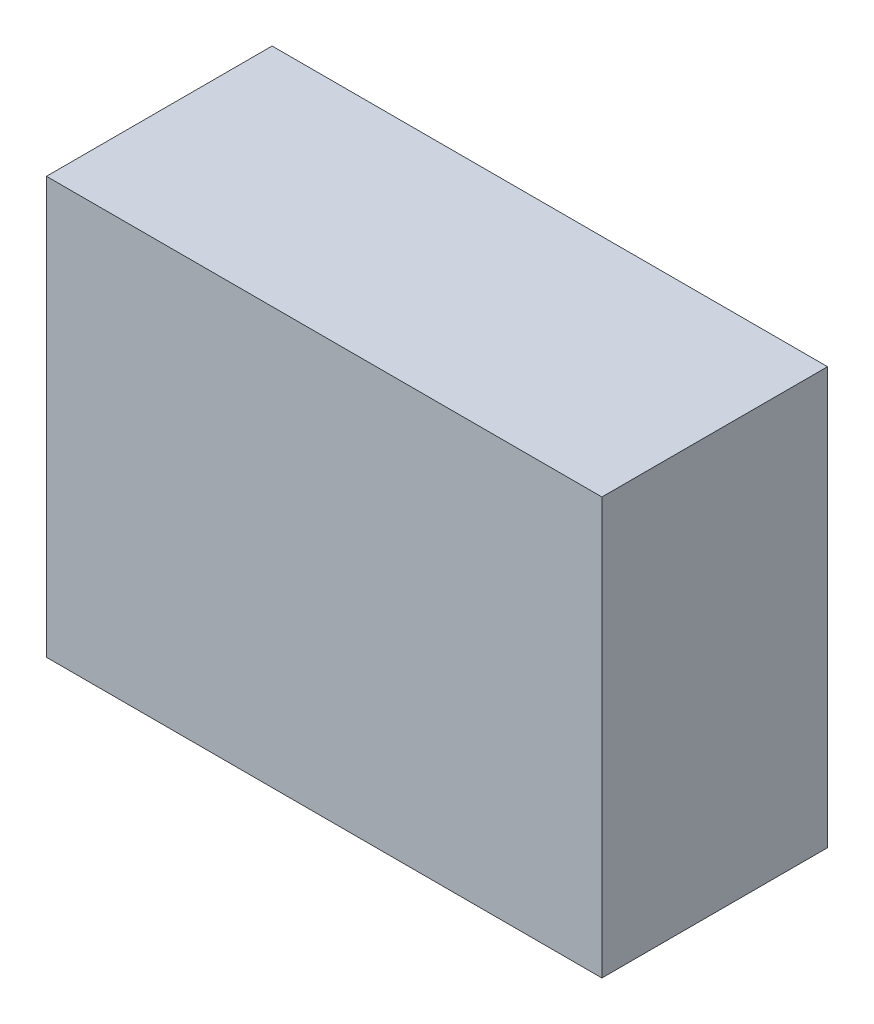
ISO-10303-21;
HEADER;
FILE_DESCRIPTION(('STEP AP214'),'2;1');
FILE_NAME('part.step','',(''),(''),'','','');
FILE_SCHEMA(('AUTOMOTIVE_DESIGN { 1 0 10303 214 1 1 1 1 }'));
ENDSEC;
DATA;
#1=APPLICATION_CONTEXT('core data for automotive mechanical design processes');
#2=APPLICATION_PROTOCOL_DEFINITION('international standard','automotive_design',2000,#1);
#3=PRODUCT_CONTEXT('',#1,'mechanical');
#4=PRODUCT('Part','Part','',(#3));
#5=PRODUCT_RELATED_PRODUCT_CATEGORY('part','',(#4));
#6=PRODUCT_DEFINITION_FORMATION('','',#4);
#7=PRODUCT_DEFINITION_CONTEXT('part definition',#1,'design');
#8=PRODUCT_DEFINITION('design','',#6,#7);
#9=PRODUCT_DEFINITION_SHAPE('','',#8);
#10=(LENGTH_UNIT() NAMED_UNIT(*) SI_UNIT(.MILLI.,.METRE.));
#11=(NAMED_UNIT(*) PLANE_ANGLE_UNIT() SI_UNIT($,.RADIAN.));
#12=(NAMED_UNIT(*) SI_UNIT($,.STERADIAN.) SOLID_ANGLE_UNIT());
#13=UNCERTAINTY_MEASURE_WITH_UNIT(LENGTH_MEASURE(1.E-05),#10,'distance_accuracy_value','');
#14=(GEOMETRIC_REPRESENTATION_CONTEXT(3) GLOBAL_UNCERTAINTY_ASSIGNED_CONTEXT((#13)) GLOBAL_UNIT_ASSIGNED_CONTEXT((#10,
#11,#12)) REPRESENTATION_CONTEXT('',''));
#15=CARTESIAN_POINT('',(0.,0.,0.));
#16=DIRECTION('',(0.,0.,1.));
#17=DIRECTION('',(1.,0.,0.));
#18=AXIS2_PLACEMENT_3D('',#15,#16,#17);
#19=CARTESIAN_POINT('',(-0.7999984,-0.5999988,0.65000124));
#20=DIRECTION('',(0.,0.,-1.));
#21=DIRECTION('',(-1.,0.,0.));
#22=AXIS2_PLACEMENT_3D('',#19,#20,#21);
#23=PLANE('',#22);
#24=DIRECTION('',(0.,1.,0.));
#25=VECTOR('',#24,1.);
#26=CARTESIAN_POINT('',(0.80000094,-0.5999988,0.65000124));
#27=LINE('',#26,#25);
#28=CARTESIAN_POINT('',(0.80000094,-0.5999988,0.65000124));
#29=VERTEX_POINT('',#28);
#30=CARTESIAN_POINT('',(0.80000094,0.5999988,0.65000124));
#31=VERTEX_POINT('',#30);
#32=EDGE_CURVE('E54',#29,#31,#27,.T.);
#33=ORIENTED_EDGE('',*,*,#32,.T.);
#34=DIRECTION('',(1.,0.,0.));
#35=VECTOR('',#34,1.);
#36=CARTESIAN_POINT('',(0.80000094,0.5999988,0.65000124));
#37=LINE('',#36,#35);
#38=CARTESIAN_POINT('',(-0.7999984,0.5999988,0.65000124));
#39=VERTEX_POINT('',#38);
#40=EDGE_CURVE('E56',#31,#39,#37,.F.);
#41=ORIENTED_EDGE('',*,*,#40,.T.);
#42=DIRECTION('',(0.,1.,0.));
#43=VECTOR('',#42,1.);
#44=CARTESIAN_POINT('',(-0.7999984,0.5999988,0.65000124));
#45=LINE('',#44,#43);
#46=CARTESIAN_POINT('',(-0.7999984,-0.5999988,0.65000124));
#47=VERTEX_POINT('',#46);
#48=EDGE_CURVE('E19',#39,#47,#45,.F.);
#49=ORIENTED_EDGE('',*,*,#48,.T.);
#50=DIRECTION('',(1.,0.,0.));
#51=VECTOR('',#50,1.);
#52=CARTESIAN_POINT('',(-0.7999984,-0.5999988,0.65000124));
#53=LINE('',#52,#51);
#54=EDGE_CURVE('E79',#47,#29,#53,.T.);
#55=ORIENTED_EDGE('',*,*,#54,.T.);
#56=EDGE_LOOP('',(#33,#41,#49,#55));
#57=FACE_BOUND('',#56,.T.);
#58=ADVANCED_FACE('F16',(#57),#23,.F.);
#59=CARTESIAN_POINT('',(-0.7999984,0.5999988,0.));
#60=DIRECTION('',(1.,0.,0.));
#61=DIRECTION('',(0.,0.,-1.));
#62=AXIS2_PLACEMENT_3D('',#59,#60,#61);
#63=PLANE('',#62);
#64=DIRECTION('',(0.,0.,1.));
#65=VECTOR('',#64,1.);
#66=CARTESIAN_POINT('',(-0.7999984,-0.5999988,0.));
#67=LINE('',#66,#65);
#68=CARTESIAN_POINT('',(-0.7999984,-0.5999988,0.));
#69=VERTEX_POINT('',#68);
#70=EDGE_CURVE('E67',#69,#47,#67,.T.);
#71=ORIENTED_EDGE('',*,*,#70,.T.);
#72=ORIENTED_EDGE('',*,*,#48,.F.);
#73=DIRECTION('',(0.,0.,-1.));
#74=VECTOR('',#73,1.);
#75=CARTESIAN_POINT('',(-0.7999984,0.5999988,0.));
#76=LINE('',#75,#74);
#77=CARTESIAN_POINT('',(-0.7999984,0.5999988,0.));
#78=VERTEX_POINT('',#77);
#79=EDGE_CURVE('E62',#39,#78,#76,.T.);
#80=ORIENTED_EDGE('',*,*,#79,.T.);
#81=DIRECTION('',(0.,1.,0.));
#82=VECTOR('',#81,1.);
#83=CARTESIAN_POINT('',(-0.7999984,-0.5999988,0.));
#84=LINE('',#83,#82);
#85=EDGE_CURVE('E82',#69,#78,#84,.T.);
#86=ORIENTED_EDGE('',*,*,#85,.F.);
#87=EDGE_LOOP('',(#71,#72,#80,#86));
#88=FACE_BOUND('',#87,.T.);
#89=ADVANCED_FACE('F64',(#88),#63,.F.);
#90=CARTESIAN_POINT('',(0.80000094,0.5999988,0.));
#91=DIRECTION('',(0.,-1.,0.));
#92=DIRECTION('',(0.,0.,-1.));
#93=AXIS2_PLACEMENT_3D('',#90,#91,#92);
#94=PLANE('',#93);
#95=ORIENTED_EDGE('',*,*,#79,.F.);
#96=ORIENTED_EDGE('',*,*,#40,.F.);
#97=DIRECTION('',(0.,0.,1.));
#98=VECTOR('',#97,1.);
#99=CARTESIAN_POINT('',(0.80000094,0.5999988,0.));
#100=LINE('',#99,#98);
#101=CARTESIAN_POINT('',(0.80000094,0.5999988,0.));
#102=VERTEX_POINT('',#101);
#103=EDGE_CURVE('E74',#31,#102,#100,.F.);
#104=ORIENTED_EDGE('',*,*,#103,.T.);
#105=DIRECTION('',(-1.,0.,0.));
#106=VECTOR('',#105,1.);
#107=CARTESIAN_POINT('',(-0.7999984,0.5999988,0.));
#108=LINE('',#107,#106);
#109=EDGE_CURVE('E71',#78,#102,#108,.F.);
#110=ORIENTED_EDGE('',*,*,#109,.F.);
#111=EDGE_LOOP('',(#95,#96,#104,#110));
#112=FACE_BOUND('',#111,.T.);
#113=ADVANCED_FACE('F69',(#112),#94,.F.);
#114=CARTESIAN_POINT('',(0.80000094,-0.5999988,0.));
#115=DIRECTION('',(-1.,0.,0.));
#116=DIRECTION('',(0.,0.,1.));
#117=AXIS2_PLACEMENT_3D('',#114,#115,#116);
#118=PLANE('',#117);
#119=ORIENTED_EDGE('',*,*,#103,.F.);
#120=ORIENTED_EDGE('',*,*,#32,.F.);
#121=DIRECTION('',(0.,0.,1.));
#122=VECTOR('',#121,1.);
#123=CARTESIAN_POINT('',(0.80000094,-0.5999988,0.));
#124=LINE('',#123,#122);
#125=CARTESIAN_POINT('',(0.80000094,-0.5999988,0.));
#126=VERTEX_POINT('',#125);
#127=EDGE_CURVE('E34',#29,#126,#124,.F.);
#128=ORIENTED_EDGE('',*,*,#127,.T.);
#129=DIRECTION('',(0.,1.,0.));
#130=VECTOR('',#129,1.);
#131=CARTESIAN_POINT('',(0.80000094,-0.5999988,0.));
#132=LINE('',#131,#130);
#133=EDGE_CURVE('E25',#102,#126,#132,.F.);
#134=ORIENTED_EDGE('',*,*,#133,.F.);
#135=EDGE_LOOP('',(#119,#120,#128,#134));
#136=FACE_BOUND('',#135,.T.);
#137=ADVANCED_FACE('F88',(#136),#118,.F.);
#138=CARTESIAN_POINT('',(-0.7999984,-0.5999988,0.));
#139=DIRECTION('',(0.,1.,0.));
#140=DIRECTION('',(0.,0.,1.));
#141=AXIS2_PLACEMENT_3D('',#138,#139,#140);
#142=PLANE('',#141);
#143=ORIENTED_EDGE('',*,*,#127,.F.);
#144=ORIENTED_EDGE('',*,*,#54,.F.);
#145=ORIENTED_EDGE('',*,*,#70,.F.);
#146=DIRECTION('',(-1.,0.,0.));
#147=VECTOR('',#146,1.);
#148=CARTESIAN_POINT('',(-0.7999984,-0.5999988,0.));
#149=LINE('',#148,#147);
#150=EDGE_CURVE('E11',#126,#69,#149,.T.);
#151=ORIENTED_EDGE('',*,*,#150,.F.);
#152=EDGE_LOOP('',(#143,#144,#145,#151));
#153=FACE_BOUND('',#152,.T.);
#154=ADVANCED_FACE('F90',(#153),#142,.F.);
#155=CARTESIAN_POINT('',(-0.7999984,-0.5999988,0.));
#156=DIRECTION('',(0.,0.,-1.));
#157=DIRECTION('',(-1.,0.,0.));
#158=AXIS2_PLACEMENT_3D('',#155,#156,#157);
#159=PLANE('',#158);
#160=ORIENTED_EDGE('',*,*,#133,.T.);
#161=ORIENTED_EDGE('',*,*,#150,.T.);
#162=ORIENTED_EDGE('',*,*,#85,.T.);
#163=ORIENTED_EDGE('',*,*,#109,.T.);
#164=EDGE_LOOP('',(#160,#161,#162,#163));
#165=FACE_BOUND('',#164,.T.);
#166=ADVANCED_FACE('F87',(#165),#159,.T.);
#167=CLOSED_SHELL('',(#58,#89,#113,#137,#154,#166));
#168=MANIFOLD_SOLID_BREP('B1',#167);
#169=ADVANCED_BREP_SHAPE_REPRESENTATION('',(#18,#168),#14);
#170=SHAPE_DEFINITION_REPRESENTATION(#9,#169);
ENDSEC;
END-ISO-10303-21;
